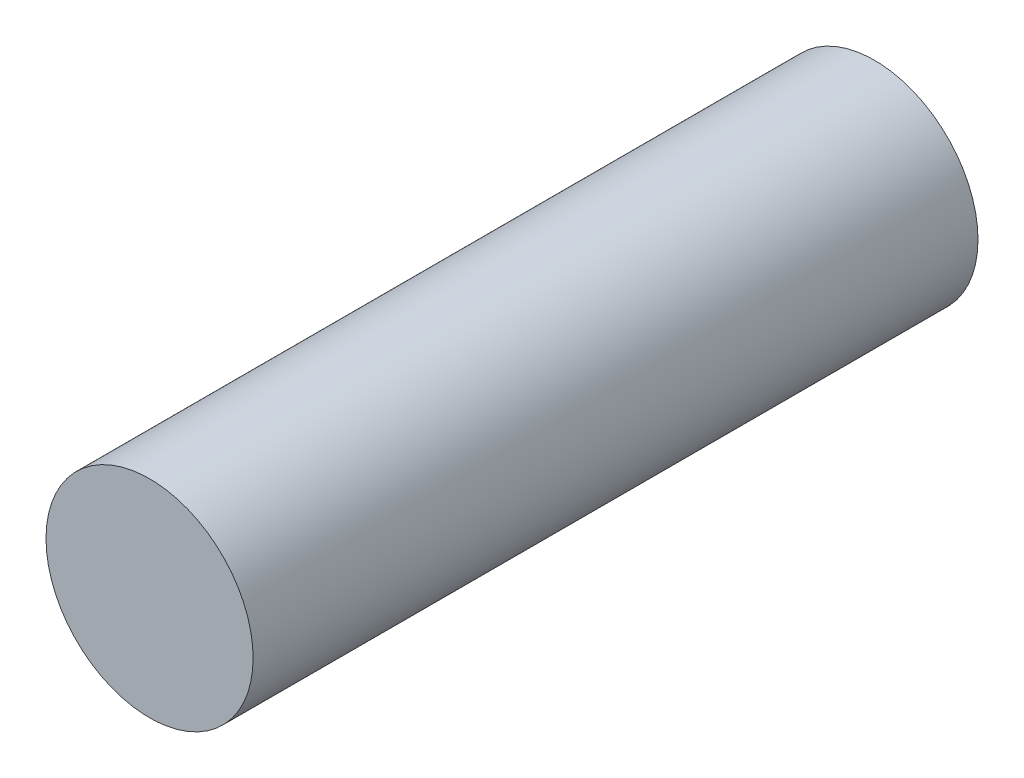
ISO-10303-21;
HEADER;
FILE_DESCRIPTION(('STEP AP214'),'2;1');
FILE_NAME('part.step','',(''),(''),'','','');
FILE_SCHEMA(('AUTOMOTIVE_DESIGN { 1 0 10303 214 1 1 1 1 }'));
ENDSEC;
DATA;
#1=APPLICATION_CONTEXT('core data for automotive mechanical design processes');
#2=APPLICATION_PROTOCOL_DEFINITION('international standard','automotive_design',2000,#1);
#3=PRODUCT_CONTEXT('',#1,'mechanical');
#4=PRODUCT('Part','Part','',(#3));
#5=PRODUCT_RELATED_PRODUCT_CATEGORY('part','',(#4));
#6=PRODUCT_DEFINITION_FORMATION('','',#4);
#7=PRODUCT_DEFINITION_CONTEXT('part definition',#1,'design');
#8=PRODUCT_DEFINITION('design','',#6,#7);
#9=PRODUCT_DEFINITION_SHAPE('','',#8);
#10=(LENGTH_UNIT() NAMED_UNIT(*) SI_UNIT(.MILLI.,.METRE.));
#11=(NAMED_UNIT(*) PLANE_ANGLE_UNIT() SI_UNIT($,.RADIAN.));
#12=(NAMED_UNIT(*) SI_UNIT($,.STERADIAN.) SOLID_ANGLE_UNIT());
#13=UNCERTAINTY_MEASURE_WITH_UNIT(LENGTH_MEASURE(1.E-05),#10,'distance_accuracy_value','');
#14=(GEOMETRIC_REPRESENTATION_CONTEXT(3) GLOBAL_UNCERTAINTY_ASSIGNED_CONTEXT((#13)) GLOBAL_UNIT_ASSIGNED_CONTEXT((#10,
#11,#12)) REPRESENTATION_CONTEXT('',''));
#15=CARTESIAN_POINT('',(0.,0.,0.));
#16=DIRECTION('',(0.,0.,1.));
#17=DIRECTION('',(1.,0.,0.));
#18=AXIS2_PLACEMENT_3D('',#15,#16,#17);
#19=CARTESIAN_POINT('',(-2.04514004574291,0.,14.));
#20=DIRECTION('',(0.,0.,-1.));
#21=DIRECTION('',(-1.,0.,0.));
#22=AXIS2_PLACEMENT_3D('',#19,#20,#21);
#23=CYLINDRICAL_SURFACE('',#22,2.);
#24=CARTESIAN_POINT('',(-2.04514004574291,0.,14.));
#25=DIRECTION('',(0.,0.,1.));
#26=DIRECTION('',(1.,0.,0.));
#27=AXIS2_PLACEMENT_3D('',#24,#25,#26);
#28=CIRCLE('',#27,2.);
#29=CARTESIAN_POINT('',(-0.0451400457429133,0.,14.));
#30=VERTEX_POINT('',#29);
#31=EDGE_CURVE('E10',#30,#30,#28,.T.);
#32=ORIENTED_EDGE('',*,*,#31,.F.);
#33=EDGE_LOOP('',(#32));
#34=FACE_BOUND('',#33,.T.);
#35=CARTESIAN_POINT('',(-2.04514004574291,0.,0.));
#36=DIRECTION('',(0.,0.,1.));
#37=DIRECTION('',(1.,0.,0.));
#38=AXIS2_PLACEMENT_3D('',#35,#36,#37);
#39=CIRCLE('',#38,2.);
#40=CARTESIAN_POINT('',(-0.0451400457429133,0.,0.));
#41=VERTEX_POINT('',#40);
#42=EDGE_CURVE('E37',#41,#41,#39,.T.);
#43=ORIENTED_EDGE('',*,*,#42,.T.);
#44=EDGE_LOOP('',(#43));
#45=FACE_BOUND('',#44,.T.);
#46=ADVANCED_FACE('F34',(#34,#45),#23,.T.);
#47=CARTESIAN_POINT('',(-2.04514004574291,0.,14.));
#48=DIRECTION('',(0.,0.,1.));
#49=DIRECTION('',(1.,0.,0.));
#50=AXIS2_PLACEMENT_3D('',#47,#48,#49);
#51=PLANE('',#50);
#52=ORIENTED_EDGE('',*,*,#31,.T.);
#53=EDGE_LOOP('',(#52));
#54=FACE_BOUND('',#53,.T.);
#55=ADVANCED_FACE('F49',(#54),#51,.T.);
#56=CARTESIAN_POINT('',(-2.04514004574291,0.,0.));
#57=DIRECTION('',(0.,0.,1.));
#58=DIRECTION('',(1.,0.,0.));
#59=AXIS2_PLACEMENT_3D('',#56,#57,#58);
#60=PLANE('',#59);
#61=ORIENTED_EDGE('',*,*,#42,.F.);
#62=EDGE_LOOP('',(#61));
#63=FACE_BOUND('',#62,.T.);
#64=ADVANCED_FACE('F47',(#63),#60,.F.);
#65=CLOSED_SHELL('',(#46,#55,#64));
#66=MANIFOLD_SOLID_BREP('B2',#65);
#67=ADVANCED_BREP_SHAPE_REPRESENTATION('',(#18,#66),#14);
#68=SHAPE_DEFINITION_REPRESENTATION(#9,#67);
ENDSEC;
END-ISO-10303-21;
